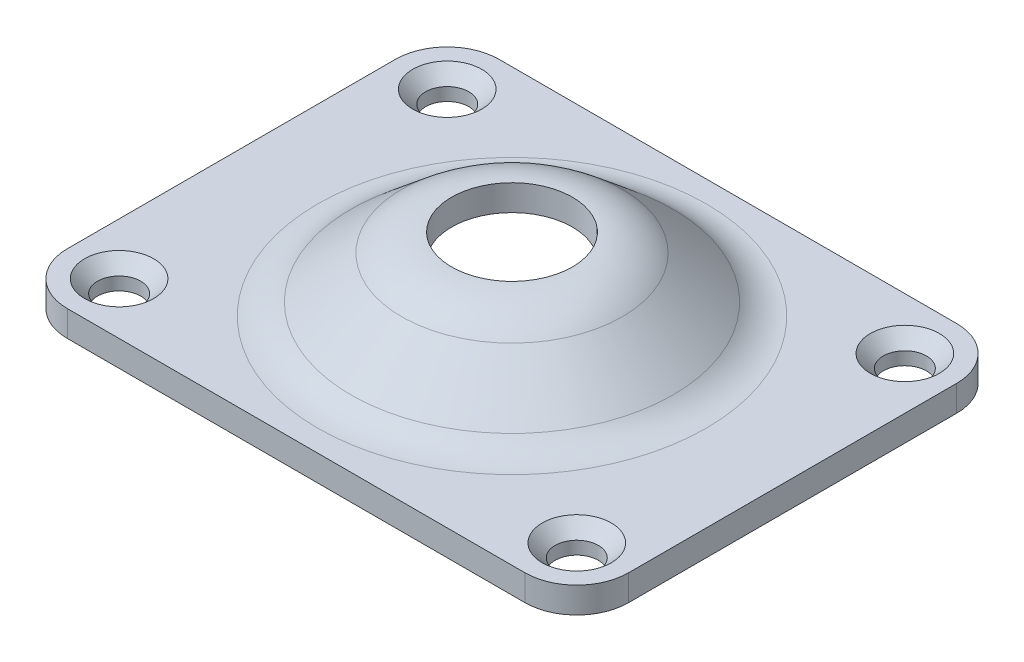
ISO-10303-21;
HEADER;
FILE_DESCRIPTION(('STEP AP214'),'2;1');
FILE_NAME('part.step','',(''),(''),'','','');
FILE_SCHEMA(('AUTOMOTIVE_DESIGN { 1 0 10303 214 1 1 1 1 }'));
ENDSEC;
DATA;
#1=APPLICATION_CONTEXT('core data for automotive mechanical design processes');
#2=APPLICATION_PROTOCOL_DEFINITION('international standard','automotive_design',2000,#1);
#3=PRODUCT_CONTEXT('',#1,'mechanical');
#4=PRODUCT('Part','Part','',(#3));
#5=PRODUCT_RELATED_PRODUCT_CATEGORY('part','',(#4));
#6=PRODUCT_DEFINITION_FORMATION('','',#4);
#7=PRODUCT_DEFINITION_CONTEXT('part definition',#1,'design');
#8=PRODUCT_DEFINITION('design','',#6,#7);
#9=PRODUCT_DEFINITION_SHAPE('','',#8);
#10=(LENGTH_UNIT() NAMED_UNIT(*) SI_UNIT(.MILLI.,.METRE.));
#11=(NAMED_UNIT(*) PLANE_ANGLE_UNIT() SI_UNIT($,.RADIAN.));
#12=(NAMED_UNIT(*) SI_UNIT($,.STERADIAN.) SOLID_ANGLE_UNIT());
#13=UNCERTAINTY_MEASURE_WITH_UNIT(LENGTH_MEASURE(1.E-05),#10,'distance_accuracy_value','');
#14=(GEOMETRIC_REPRESENTATION_CONTEXT(3) GLOBAL_UNCERTAINTY_ASSIGNED_CONTEXT((#13)) GLOBAL_UNIT_ASSIGNED_CONTEXT((#10,
#11,#12)) REPRESENTATION_CONTEXT('',''));
#15=CARTESIAN_POINT('',(0.,0.,0.));
#16=DIRECTION('',(0.,0.,1.));
#17=DIRECTION('',(1.,0.,0.));
#18=AXIS2_PLACEMENT_3D('',#15,#16,#17);
#19=CARTESIAN_POINT('',(-26.5,3.,19.));
#20=DIRECTION('',(0.,-1.,0.));
#21=DIRECTION('',(0.,0.,-1.));
#22=AXIS2_PLACEMENT_3D('',#19,#20,#21);
#23=PLANE('',#22);
#24=CARTESIAN_POINT('',(26.5,3.,19.));
#25=DIRECTION('',(0.,-1.,0.));
#26=DIRECTION('',(0.,0.,-1.));
#27=AXIS2_PLACEMENT_3D('',#24,#25,#26);
#28=CIRCLE('',#27,3.99999999999999);
#29=CARTESIAN_POINT('',(26.5,3.,23.));
#30=VERTEX_POINT('',#29);
#31=EDGE_CURVE('E177',#30,#30,#28,.T.);
#32=ORIENTED_EDGE('',*,*,#31,.T.);
#33=EDGE_LOOP('',(#32));
#34=FACE_BOUND('',#33,.T.);
#35=CARTESIAN_POINT('',(-26.5,3.,19.));
#36=DIRECTION('',(0.,-1.,0.));
#37=DIRECTION('',(0.,0.,-1.));
#38=AXIS2_PLACEMENT_3D('',#35,#36,#37);
#39=CIRCLE('',#38,3.99999999999999);
#40=CARTESIAN_POINT('',(-26.5,3.,23.));
#41=VERTEX_POINT('',#40);
#42=EDGE_CURVE('E174',#41,#41,#39,.T.);
#43=ORIENTED_EDGE('',*,*,#42,.T.);
#44=EDGE_LOOP('',(#43));
#45=FACE_BOUND('',#44,.T.);
#46=CARTESIAN_POINT('',(-26.5,3.,-19.));
#47=DIRECTION('',(0.,-1.,0.));
#48=DIRECTION('',(0.,0.,-1.));
#49=AXIS2_PLACEMENT_3D('',#46,#47,#48);
#50=CIRCLE('',#49,3.99999999999999);
#51=CARTESIAN_POINT('',(-26.5,3.,-15.));
#52=VERTEX_POINT('',#51);
#53=EDGE_CURVE('E171',#52,#52,#50,.T.);
#54=ORIENTED_EDGE('',*,*,#53,.T.);
#55=EDGE_LOOP('',(#54));
#56=FACE_BOUND('',#55,.T.);
#57=CARTESIAN_POINT('',(26.5,3.,-19.));
#58=DIRECTION('',(0.,-1.,0.));
#59=DIRECTION('',(0.,0.,-1.));
#60=AXIS2_PLACEMENT_3D('',#57,#58,#59);
#61=CIRCLE('',#60,3.99999999999999);
#62=CARTESIAN_POINT('',(26.5,3.,-15.));
#63=VERTEX_POINT('',#62);
#64=EDGE_CURVE('E168',#63,#63,#61,.T.);
#65=ORIENTED_EDGE('',*,*,#64,.T.);
#66=EDGE_LOOP('',(#65));
#67=FACE_BOUND('',#66,.T.);
#68=CARTESIAN_POINT('',(-26.5,3.,19.));
#69=DIRECTION('',(0.,1.,0.));
#70=DIRECTION('',(0.,0.,-1.));
#71=AXIS2_PLACEMENT_3D('',#68,#69,#70);
#72=CIRCLE('',#71,6.);
#73=CARTESIAN_POINT('',(-32.5,3.,19.));
#74=VERTEX_POINT('',#73);
#75=CARTESIAN_POINT('',(-26.5,3.,25.));
#76=VERTEX_POINT('',#75);
#77=EDGE_CURVE('E150',#74,#76,#72,.T.);
#78=ORIENTED_EDGE('',*,*,#77,.T.);
#79=DIRECTION('',(1.,0.,0.));
#80=VECTOR('',#79,1.);
#81=CARTESIAN_POINT('',(-26.5,3.,25.));
#82=LINE('',#81,#80);
#83=CARTESIAN_POINT('',(26.4999999999999,3.,25.));
#84=VERTEX_POINT('',#83);
#85=EDGE_CURVE('E98',#76,#84,#82,.T.);
#86=ORIENTED_EDGE('',*,*,#85,.T.);
#87=CARTESIAN_POINT('',(26.5,3.,19.));
#88=DIRECTION('',(0.,1.,0.));
#89=DIRECTION('',(0.,0.,1.));
#90=AXIS2_PLACEMENT_3D('',#87,#88,#89);
#91=CIRCLE('',#90,6.);
#92=CARTESIAN_POINT('',(32.5,3.,19.));
#93=VERTEX_POINT('',#92);
#94=EDGE_CURVE('E280',#84,#93,#91,.T.);
#95=ORIENTED_EDGE('',*,*,#94,.T.);
#96=DIRECTION('',(0.,0.,-1.));
#97=VECTOR('',#96,1.);
#98=CARTESIAN_POINT('',(32.5,3.,19.));
#99=LINE('',#98,#97);
#100=CARTESIAN_POINT('',(32.5,3.,-19.));
#101=VERTEX_POINT('',#100);
#102=EDGE_CURVE('E282',#93,#101,#99,.T.);
#103=ORIENTED_EDGE('',*,*,#102,.T.);
#104=CARTESIAN_POINT('',(26.5,3.,-19.));
#105=DIRECTION('',(0.,1.,0.));
#106=DIRECTION('',(0.,0.,-1.));
#107=AXIS2_PLACEMENT_3D('',#104,#105,#106);
#108=CIRCLE('',#107,6.);
#109=CARTESIAN_POINT('',(26.4999999999999,3.,-25.));
#110=VERTEX_POINT('',#109);
#111=EDGE_CURVE('E117',#101,#110,#108,.T.);
#112=ORIENTED_EDGE('',*,*,#111,.T.);
#113=DIRECTION('',(-1.,0.,0.));
#114=VECTOR('',#113,1.);
#115=CARTESIAN_POINT('',(-26.5,3.,-25.));
#116=LINE('',#115,#114);
#117=CARTESIAN_POINT('',(-26.5,3.,-25.));
#118=VERTEX_POINT('',#117);
#119=EDGE_CURVE('E111',#110,#118,#116,.T.);
#120=ORIENTED_EDGE('',*,*,#119,.T.);
#121=CARTESIAN_POINT('',(-26.5,3.,-19.));
#122=DIRECTION('',(0.,1.,0.));
#123=DIRECTION('',(0.,0.,-1.));
#124=AXIS2_PLACEMENT_3D('',#121,#122,#123);
#125=CIRCLE('',#124,6.);
#126=CARTESIAN_POINT('',(-32.5,3.,-19.));
#127=VERTEX_POINT('',#126);
#128=EDGE_CURVE('E115',#118,#127,#125,.T.);
#129=ORIENTED_EDGE('',*,*,#128,.T.);
#130=DIRECTION('',(0.,0.,1.));
#131=VECTOR('',#130,1.);
#132=CARTESIAN_POINT('',(-32.5,3.,19.));
#133=LINE('',#132,#131);
#134=EDGE_CURVE('E54',#127,#74,#133,.T.);
#135=ORIENTED_EDGE('',*,*,#134,.T.);
#136=EDGE_LOOP('',(#78,#86,#95,#103,#112,#120,#129,#135));
#137=FACE_BOUND('',#136,.T.);
#138=CARTESIAN_POINT('',(0.,3.,0.));
#139=DIRECTION('',(0.,1.,0.));
#140=DIRECTION('',(0.,0.,1.));
#141=AXIS2_PLACEMENT_3D('',#138,#139,#140);
#142=CIRCLE('',#141,22.5);
#143=CARTESIAN_POINT('',(0.,3.,22.5));
#144=VERTEX_POINT('',#143);
#145=EDGE_CURVE('E264',#144,#144,#142,.T.);
#146=ORIENTED_EDGE('',*,*,#145,.F.);
#147=EDGE_LOOP('',(#146));
#148=FACE_BOUND('',#147,.T.);
#149=ADVANCED_FACE('F37',(#34,#45,#56,#67,#137,#148),#23,.F.);
#150=CARTESIAN_POINT('',(-26.5,0.,19.));
#151=DIRECTION('',(0.,-1.,0.));
#152=DIRECTION('',(0.,0.,-1.));
#153=AXIS2_PLACEMENT_3D('',#150,#151,#152);
#154=PLANE('',#153);
#155=CARTESIAN_POINT('',(26.5,0.,19.));
#156=DIRECTION('',(0.,1.,0.));
#157=DIRECTION('',(0.,0.,1.));
#158=AXIS2_PLACEMENT_3D('',#155,#156,#157);
#159=CIRCLE('',#158,2.5);
#160=CARTESIAN_POINT('',(26.5,0.,21.5));
#161=VERTEX_POINT('',#160);
#162=EDGE_CURVE('E262',#161,#161,#159,.T.);
#163=ORIENTED_EDGE('',*,*,#162,.T.);
#164=EDGE_LOOP('',(#163));
#165=FACE_BOUND('',#164,.T.);
#166=CARTESIAN_POINT('',(-26.5,0.,-19.));
#167=DIRECTION('',(0.,1.,0.));
#168=DIRECTION('',(0.,0.,1.));
#169=AXIS2_PLACEMENT_3D('',#166,#167,#168);
#170=CIRCLE('',#169,2.5);
#171=CARTESIAN_POINT('',(-26.5,0.,-16.5));
#172=VERTEX_POINT('',#171);
#173=EDGE_CURVE('E267',#172,#172,#170,.T.);
#174=ORIENTED_EDGE('',*,*,#173,.T.);
#175=EDGE_LOOP('',(#174));
#176=FACE_BOUND('',#175,.T.);
#177=CARTESIAN_POINT('',(-26.5,0.,19.));
#178=DIRECTION('',(0.,1.,0.));
#179=DIRECTION('',(0.,0.,-1.));
#180=AXIS2_PLACEMENT_3D('',#177,#178,#179);
#181=CIRCLE('',#180,6.);
#182=CARTESIAN_POINT('',(-32.5,0.,19.));
#183=VERTEX_POINT('',#182);
#184=CARTESIAN_POINT('',(-26.5,0.,25.));
#185=VERTEX_POINT('',#184);
#186=EDGE_CURVE('E135',#183,#185,#181,.T.);
#187=ORIENTED_EDGE('',*,*,#186,.F.);
#188=DIRECTION('',(0.,0.,1.));
#189=VECTOR('',#188,1.);
#190=CARTESIAN_POINT('',(-32.5,0.,19.));
#191=LINE('',#190,#189);
#192=CARTESIAN_POINT('',(-32.5,0.,-19.));
#193=VERTEX_POINT('',#192);
#194=EDGE_CURVE('E89',#193,#183,#191,.T.);
#195=ORIENTED_EDGE('',*,*,#194,.F.);
#196=CARTESIAN_POINT('',(-26.5,0.,-19.));
#197=DIRECTION('',(0.,1.,0.));
#198=DIRECTION('',(0.,0.,-1.));
#199=AXIS2_PLACEMENT_3D('',#196,#197,#198);
#200=CIRCLE('',#199,6.);
#201=CARTESIAN_POINT('',(-26.5,0.,-25.));
#202=VERTEX_POINT('',#201);
#203=EDGE_CURVE('E83',#202,#193,#200,.T.);
#204=ORIENTED_EDGE('',*,*,#203,.F.);
#205=DIRECTION('',(-1.,0.,0.));
#206=VECTOR('',#205,1.);
#207=CARTESIAN_POINT('',(-26.5,0.,-25.));
#208=LINE('',#207,#206);
#209=CARTESIAN_POINT('',(26.4999999999999,0.,-25.));
#210=VERTEX_POINT('',#209);
#211=EDGE_CURVE('E125',#210,#202,#208,.T.);
#212=ORIENTED_EDGE('',*,*,#211,.F.);
#213=CARTESIAN_POINT('',(26.5,0.,-19.));
#214=DIRECTION('',(0.,1.,0.));
#215=DIRECTION('',(0.,0.,-1.));
#216=AXIS2_PLACEMENT_3D('',#213,#214,#215);
#217=CIRCLE('',#216,6.);
#218=CARTESIAN_POINT('',(32.5,0.,-19.));
#219=VERTEX_POINT('',#218);
#220=EDGE_CURVE('E145',#219,#210,#217,.T.);
#221=ORIENTED_EDGE('',*,*,#220,.F.);
#222=DIRECTION('',(0.,0.,-1.));
#223=VECTOR('',#222,1.);
#224=CARTESIAN_POINT('',(32.5,0.,19.));
#225=LINE('',#224,#223);
#226=CARTESIAN_POINT('',(32.5,0.,19.));
#227=VERTEX_POINT('',#226);
#228=EDGE_CURVE('E143',#227,#219,#225,.T.);
#229=ORIENTED_EDGE('',*,*,#228,.F.);
#230=CARTESIAN_POINT('',(26.5,0.,19.));
#231=DIRECTION('',(0.,1.,0.));
#232=DIRECTION('',(0.,0.,1.));
#233=AXIS2_PLACEMENT_3D('',#230,#231,#232);
#234=CIRCLE('',#233,6.);
#235=CARTESIAN_POINT('',(26.4999999999999,0.,25.));
#236=VERTEX_POINT('',#235);
#237=EDGE_CURVE('E141',#236,#227,#234,.T.);
#238=ORIENTED_EDGE('',*,*,#237,.F.);
#239=DIRECTION('',(1.,0.,0.));
#240=VECTOR('',#239,1.);
#241=CARTESIAN_POINT('',(-26.5,0.,25.));
#242=LINE('',#241,#240);
#243=EDGE_CURVE('E138',#185,#236,#242,.T.);
#244=ORIENTED_EDGE('',*,*,#243,.F.);
#245=EDGE_LOOP('',(#187,#195,#204,#212,#221,#229,#238,#244));
#246=FACE_BOUND('',#245,.T.);
#247=CARTESIAN_POINT('',(-26.5,0.,19.));
#248=DIRECTION('',(0.,1.,0.));
#249=DIRECTION('',(0.,0.,1.));
#250=AXIS2_PLACEMENT_3D('',#247,#248,#249);
#251=CIRCLE('',#250,2.5);
#252=CARTESIAN_POINT('',(-26.5,0.,21.5));
#253=VERTEX_POINT('',#252);
#254=EDGE_CURVE('E139',#253,#253,#251,.T.);
#255=ORIENTED_EDGE('',*,*,#254,.T.);
#256=EDGE_LOOP('',(#255));
#257=FACE_BOUND('',#256,.T.);
#258=CARTESIAN_POINT('',(26.5,0.,-19.));
#259=DIRECTION('',(0.,1.,0.));
#260=DIRECTION('',(0.,0.,1.));
#261=AXIS2_PLACEMENT_3D('',#258,#259,#260);
#262=CIRCLE('',#261,2.5);
#263=CARTESIAN_POINT('',(26.5,0.,-16.5));
#264=VERTEX_POINT('',#263);
#265=EDGE_CURVE('E263',#264,#264,#262,.T.);
#266=ORIENTED_EDGE('',*,*,#265,.T.);
#267=EDGE_LOOP('',(#266));
#268=FACE_BOUND('',#267,.T.);
#269=CARTESIAN_POINT('',(0.,0.,0.));
#270=DIRECTION('',(0.,-1.,0.));
#271=DIRECTION('',(1.,0.,0.));
#272=AXIS2_PLACEMENT_3D('',#269,#270,#271);
#273=CIRCLE('',#272,22.5);
#274=CARTESIAN_POINT('',(22.5,0.,0.));
#275=VERTEX_POINT('',#274);
#276=EDGE_CURVE('E301',#275,#275,#273,.T.);
#277=ORIENTED_EDGE('',*,*,#276,.F.);
#278=EDGE_LOOP('',(#277));
#279=FACE_BOUND('',#278,.T.);
#280=ADVANCED_FACE('F202',(#165,#176,#246,#257,#268,#279),#154,.T.);
#281=CARTESIAN_POINT('',(-26.5,3.,19.));
#282=DIRECTION('',(0.,-1.,0.));
#283=DIRECTION('',(0.,0.,-1.));
#284=AXIS2_PLACEMENT_3D('',#281,#282,#283);
#285=CYLINDRICAL_SURFACE('',#284,6.);
#286=ORIENTED_EDGE('',*,*,#186,.T.);
#287=DIRECTION('',(0.,-1.,0.));
#288=VECTOR('',#287,1.);
#289=CARTESIAN_POINT('',(-26.5,3.,25.));
#290=LINE('',#289,#288);
#291=EDGE_CURVE('E163',#76,#185,#290,.T.);
#292=ORIENTED_EDGE('',*,*,#291,.F.);
#293=ORIENTED_EDGE('',*,*,#77,.F.);
#294=DIRECTION('',(0.,-1.,0.));
#295=VECTOR('',#294,1.);
#296=CARTESIAN_POINT('',(-32.5,3.,19.));
#297=LINE('',#296,#295);
#298=EDGE_CURVE('E131',#74,#183,#297,.T.);
#299=ORIENTED_EDGE('',*,*,#298,.T.);
#300=EDGE_LOOP('',(#286,#292,#293,#299));
#301=FACE_BOUND('',#300,.T.);
#302=ADVANCED_FACE('F208',(#301),#285,.T.);
#303=CARTESIAN_POINT('',(-26.5,3.,25.));
#304=DIRECTION('',(0.,0.,-1.));
#305=DIRECTION('',(-1.,0.,0.));
#306=AXIS2_PLACEMENT_3D('',#303,#304,#305);
#307=PLANE('',#306);
#308=ORIENTED_EDGE('',*,*,#243,.T.);
#309=DIRECTION('',(0.,-1.,0.));
#310=VECTOR('',#309,1.);
#311=CARTESIAN_POINT('',(26.4999999999999,3.,25.));
#312=LINE('',#311,#310);
#313=EDGE_CURVE('E160',#84,#236,#312,.T.);
#314=ORIENTED_EDGE('',*,*,#313,.F.);
#315=ORIENTED_EDGE('',*,*,#85,.F.);
#316=ORIENTED_EDGE('',*,*,#291,.T.);
#317=EDGE_LOOP('',(#308,#314,#315,#316));
#318=FACE_BOUND('',#317,.T.);
#319=ADVANCED_FACE('F234',(#318),#307,.F.);
#320=CARTESIAN_POINT('',(26.5,3.,19.));
#321=DIRECTION('',(0.,-1.,0.));
#322=DIRECTION('',(0.,0.,-1.));
#323=AXIS2_PLACEMENT_3D('',#320,#321,#322);
#324=CYLINDRICAL_SURFACE('',#323,6.);
#325=ORIENTED_EDGE('',*,*,#237,.T.);
#326=DIRECTION('',(0.,-1.,0.));
#327=VECTOR('',#326,1.);
#328=CARTESIAN_POINT('',(32.5,3.,19.));
#329=LINE('',#328,#327);
#330=EDGE_CURVE('E157',#93,#227,#329,.T.);
#331=ORIENTED_EDGE('',*,*,#330,.F.);
#332=ORIENTED_EDGE('',*,*,#94,.F.);
#333=ORIENTED_EDGE('',*,*,#313,.T.);
#334=EDGE_LOOP('',(#325,#331,#332,#333));
#335=FACE_BOUND('',#334,.T.);
#336=ADVANCED_FACE('F230',(#335),#324,.T.);
#337=CARTESIAN_POINT('',(32.5,3.,19.));
#338=DIRECTION('',(-1.,0.,0.));
#339=DIRECTION('',(0.,0.,1.));
#340=AXIS2_PLACEMENT_3D('',#337,#338,#339);
#341=PLANE('',#340);
#342=ORIENTED_EDGE('',*,*,#228,.T.);
#343=DIRECTION('',(0.,-1.,0.));
#344=VECTOR('',#343,1.);
#345=CARTESIAN_POINT('',(32.5,3.,-19.));
#346=LINE('',#345,#344);
#347=EDGE_CURVE('E154',#101,#219,#346,.T.);
#348=ORIENTED_EDGE('',*,*,#347,.F.);
#349=ORIENTED_EDGE('',*,*,#102,.F.);
#350=ORIENTED_EDGE('',*,*,#330,.T.);
#351=EDGE_LOOP('',(#342,#348,#349,#350));
#352=FACE_BOUND('',#351,.T.);
#353=ADVANCED_FACE('F226',(#352),#341,.F.);
#354=CARTESIAN_POINT('',(26.5,3.,-19.));
#355=DIRECTION('',(0.,-1.,0.));
#356=DIRECTION('',(0.,0.,-1.));
#357=AXIS2_PLACEMENT_3D('',#354,#355,#356);
#358=CYLINDRICAL_SURFACE('',#357,6.);
#359=ORIENTED_EDGE('',*,*,#220,.T.);
#360=DIRECTION('',(0.,-1.,0.));
#361=VECTOR('',#360,1.);
#362=CARTESIAN_POINT('',(26.4999999999999,3.,-25.));
#363=LINE('',#362,#361);
#364=EDGE_CURVE('E126',#110,#210,#363,.T.);
#365=ORIENTED_EDGE('',*,*,#364,.F.);
#366=ORIENTED_EDGE('',*,*,#111,.F.);
#367=ORIENTED_EDGE('',*,*,#347,.T.);
#368=EDGE_LOOP('',(#359,#365,#366,#367));
#369=FACE_BOUND('',#368,.T.);
#370=ADVANCED_FACE('F223',(#369),#358,.T.);
#371=CARTESIAN_POINT('',(-26.5,3.,-25.));
#372=DIRECTION('',(0.,0.,1.));
#373=DIRECTION('',(1.,0.,0.));
#374=AXIS2_PLACEMENT_3D('',#371,#372,#373);
#375=PLANE('',#374);
#376=ORIENTED_EDGE('',*,*,#211,.T.);
#377=DIRECTION('',(0.,-1.,0.));
#378=VECTOR('',#377,1.);
#379=CARTESIAN_POINT('',(-26.5,3.,-25.));
#380=LINE('',#379,#378);
#381=EDGE_CURVE('E122',#118,#202,#380,.T.);
#382=ORIENTED_EDGE('',*,*,#381,.F.);
#383=ORIENTED_EDGE('',*,*,#119,.F.);
#384=ORIENTED_EDGE('',*,*,#364,.T.);
#385=EDGE_LOOP('',(#376,#382,#383,#384));
#386=FACE_BOUND('',#385,.T.);
#387=ADVANCED_FACE('F123',(#386),#375,.F.);
#388=CARTESIAN_POINT('',(-26.5,3.,-19.));
#389=DIRECTION('',(0.,-1.,0.));
#390=DIRECTION('',(0.,0.,-1.));
#391=AXIS2_PLACEMENT_3D('',#388,#389,#390);
#392=CYLINDRICAL_SURFACE('',#391,6.);
#393=ORIENTED_EDGE('',*,*,#203,.T.);
#394=DIRECTION('',(0.,-1.,0.));
#395=VECTOR('',#394,1.);
#396=CARTESIAN_POINT('',(-32.5,3.,-19.));
#397=LINE('',#396,#395);
#398=EDGE_CURVE('E127',#127,#193,#397,.T.);
#399=ORIENTED_EDGE('',*,*,#398,.F.);
#400=ORIENTED_EDGE('',*,*,#128,.F.);
#401=ORIENTED_EDGE('',*,*,#381,.T.);
#402=EDGE_LOOP('',(#393,#399,#400,#401));
#403=FACE_BOUND('',#402,.T.);
#404=ADVANCED_FACE('F129',(#403),#392,.T.);
#405=CARTESIAN_POINT('',(-32.5,3.,19.));
#406=DIRECTION('',(1.,0.,0.));
#407=DIRECTION('',(0.,0.,-1.));
#408=AXIS2_PLACEMENT_3D('',#405,#406,#407);
#409=PLANE('',#408);
#410=ORIENTED_EDGE('',*,*,#194,.T.);
#411=ORIENTED_EDGE('',*,*,#298,.F.);
#412=ORIENTED_EDGE('',*,*,#134,.F.);
#413=ORIENTED_EDGE('',*,*,#398,.T.);
#414=EDGE_LOOP('',(#410,#411,#412,#413));
#415=FACE_BOUND('',#414,.T.);
#416=ADVANCED_FACE('F216',(#415),#409,.F.);
#417=CARTESIAN_POINT('',(-26.5,3.,19.));
#418=DIRECTION('',(0.,-1.,0.));
#419=DIRECTION('',(0.,0.,-1.));
#420=AXIS2_PLACEMENT_3D('',#417,#418,#419);
#421=CYLINDRICAL_SURFACE('',#420,2.5);
#422=CARTESIAN_POINT('',(-26.5,1.50000000000001,19.));
#423=DIRECTION('',(0.,-1.,0.));
#424=DIRECTION('',(0.,0.,-1.));
#425=AXIS2_PLACEMENT_3D('',#422,#423,#424);
#426=CIRCLE('',#425,2.5);
#427=CARTESIAN_POINT('',(-26.5,1.50000000000001,21.5));
#428=VERTEX_POINT('',#427);
#429=EDGE_CURVE('E180',#428,#428,#426,.F.);
#430=ORIENTED_EDGE('',*,*,#429,.T.);
#431=EDGE_LOOP('',(#430));
#432=FACE_BOUND('',#431,.T.);
#433=ORIENTED_EDGE('',*,*,#254,.F.);
#434=EDGE_LOOP('',(#433));
#435=FACE_BOUND('',#434,.T.);
#436=ADVANCED_FACE('F213',(#432,#435),#421,.F.);
#437=CARTESIAN_POINT('',(-26.5,3.,-19.));
#438=DIRECTION('',(0.,-1.,0.));
#439=DIRECTION('',(0.,0.,-1.));
#440=AXIS2_PLACEMENT_3D('',#437,#438,#439);
#441=CYLINDRICAL_SURFACE('',#440,2.5);
#442=CARTESIAN_POINT('',(-26.5,1.50000000000001,-19.));
#443=DIRECTION('',(0.,-1.,0.));
#444=DIRECTION('',(0.,0.,-1.));
#445=AXIS2_PLACEMENT_3D('',#442,#443,#444);
#446=CIRCLE('',#445,2.5);
#447=CARTESIAN_POINT('',(-26.5,1.50000000000001,-16.5));
#448=VERTEX_POINT('',#447);
#449=EDGE_CURVE('E46',#448,#448,#446,.F.);
#450=ORIENTED_EDGE('',*,*,#449,.T.);
#451=EDGE_LOOP('',(#450));
#452=FACE_BOUND('',#451,.T.);
#453=ORIENTED_EDGE('',*,*,#173,.F.);
#454=EDGE_LOOP('',(#453));
#455=FACE_BOUND('',#454,.T.);
#456=ADVANCED_FACE('F185',(#452,#455),#441,.F.);
#457=CARTESIAN_POINT('',(26.5,3.,-19.));
#458=DIRECTION('',(0.,-1.,0.));
#459=DIRECTION('',(0.,0.,-1.));
#460=AXIS2_PLACEMENT_3D('',#457,#458,#459);
#461=CYLINDRICAL_SURFACE('',#460,2.5);
#462=CARTESIAN_POINT('',(26.5,1.50000000000001,-19.));
#463=DIRECTION('',(0.,-1.,0.));
#464=DIRECTION('',(0.,0.,-1.));
#465=AXIS2_PLACEMENT_3D('',#462,#463,#464);
#466=CIRCLE('',#465,2.5);
#467=CARTESIAN_POINT('',(26.5,1.50000000000001,-16.5));
#468=VERTEX_POINT('',#467);
#469=EDGE_CURVE('E11',#468,#468,#466,.F.);
#470=ORIENTED_EDGE('',*,*,#469,.T.);
#471=EDGE_LOOP('',(#470));
#472=FACE_BOUND('',#471,.T.);
#473=ORIENTED_EDGE('',*,*,#265,.F.);
#474=EDGE_LOOP('',(#473));
#475=FACE_BOUND('',#474,.T.);
#476=ADVANCED_FACE('F258',(#472,#475),#461,.F.);
#477=CARTESIAN_POINT('',(26.5,3.,19.));
#478=DIRECTION('',(0.,-1.,0.));
#479=DIRECTION('',(0.,0.,-1.));
#480=AXIS2_PLACEMENT_3D('',#477,#478,#479);
#481=CYLINDRICAL_SURFACE('',#480,2.5);
#482=CARTESIAN_POINT('',(26.5,1.50000000000001,19.));
#483=DIRECTION('',(0.,-1.,0.));
#484=DIRECTION('',(0.,0.,-1.));
#485=AXIS2_PLACEMENT_3D('',#482,#483,#484);
#486=CIRCLE('',#485,2.5);
#487=CARTESIAN_POINT('',(26.5,1.50000000000001,21.5));
#488=VERTEX_POINT('',#487);
#489=EDGE_CURVE('E165',#488,#488,#486,.F.);
#490=ORIENTED_EDGE('',*,*,#489,.T.);
#491=EDGE_LOOP('',(#490));
#492=FACE_BOUND('',#491,.T.);
#493=ORIENTED_EDGE('',*,*,#162,.F.);
#494=EDGE_LOOP('',(#493));
#495=FACE_BOUND('',#494,.T.);
#496=ADVANCED_FACE('F254',(#492,#495),#481,.F.);
#497=CARTESIAN_POINT('',(0.,9.,0.));
#498=DIRECTION('',(0.,-1.,0.));
#499=DIRECTION('',(1.,0.,0.));
#500=AXIS2_PLACEMENT_3D('',#497,#498,#499);
#501=TOROIDAL_SURFACE('',#500,22.5,6.);
#502=ORIENTED_EDGE('',*,*,#145,.T.);
#503=EDGE_LOOP('',(#502));
#504=FACE_BOUND('',#503,.T.);
#505=CARTESIAN_POINT('',(0.,4.40373334128613,0.));
#506=DIRECTION('',(0.,-1.,0.));
#507=DIRECTION('',(1.,0.,0.));
#508=AXIS2_PLACEMENT_3D('',#505,#506,#507);
#509=CIRCLE('',#508,18.6432743418808);
#510=CARTESIAN_POINT('',(18.6432743418808,4.40373334128613,0.));
#511=VERTEX_POINT('',#510);
#512=EDGE_CURVE('E270',#511,#511,#509,.T.);
#513=ORIENTED_EDGE('',*,*,#512,.T.);
#514=EDGE_LOOP('',(#513));
#515=FACE_BOUND('',#514,.T.);
#516=ADVANCED_FACE('F257',(#504,#515),#501,.F.);
#517=CARTESIAN_POINT('',(0.,9.31933493133446,0.));
#518=DIRECTION('',(0.,-1.,0.));
#519=DIRECTION('',(1.,0.,0.));
#520=AXIS2_PLACEMENT_3D('',#517,#518,#519);
#521=CONICAL_SURFACE('',#520,12.7850884871788,0.872664625997166);
#522=ORIENTED_EDGE('',*,*,#512,.F.);
#523=EDGE_LOOP('',(#522));
#524=FACE_BOUND('',#523,.T.);
#525=CARTESIAN_POINT('',(0.,9.31933493133446,0.));
#526=DIRECTION('',(0.,-1.,0.));
#527=DIRECTION('',(1.,0.,0.));
#528=AXIS2_PLACEMENT_3D('',#525,#526,#527);
#529=CIRCLE('',#528,12.7850884871788);
#530=CARTESIAN_POINT('',(12.7850884871788,9.31933493133446,0.));
#531=VERTEX_POINT('',#530);
#532=EDGE_CURVE('E317',#531,#531,#529,.T.);
#533=ORIENTED_EDGE('',*,*,#532,.T.);
#534=EDGE_LOOP('',(#533));
#535=FACE_BOUND('',#534,.T.);
#536=ADVANCED_FACE('F323',(#524,#535),#521,.T.);
#537=CARTESIAN_POINT('',(0.,2.42493494326365,0.));
#538=DIRECTION('',(0.,-1.,0.));
#539=DIRECTION('',(1.,0.,0.));
#540=AXIS2_PLACEMENT_3D('',#537,#538,#539);
#541=DEGENERATE_TOROIDAL_SURFACE('',#540,7.,9.,.T.);
#542=ORIENTED_EDGE('',*,*,#532,.F.);
#543=EDGE_LOOP('',(#542));
#544=FACE_BOUND('',#543,.T.);
#545=CARTESIAN_POINT('',(0.,11.4249349432636,0.));
#546=DIRECTION('',(0.,-1.,0.));
#547=DIRECTION('',(1.,0.,0.));
#548=AXIS2_PLACEMENT_3D('',#545,#546,#547);
#549=CIRCLE('',#548,7.);
#550=CARTESIAN_POINT('',(7.,11.4249349432636,0.));
#551=VERTEX_POINT('',#550);
#552=EDGE_CURVE('E314',#551,#551,#549,.T.);
#553=ORIENTED_EDGE('',*,*,#552,.T.);
#554=EDGE_LOOP('',(#553));
#555=FACE_BOUND('',#554,.T.);
#556=ADVANCED_FACE('F326',(#544,#555),#541,.T.);
#557=CARTESIAN_POINT('',(0.,0.,0.));
#558=DIRECTION('',(0.,-1.,0.));
#559=DIRECTION('',(1.,0.,0.));
#560=AXIS2_PLACEMENT_3D('',#557,#558,#559);
#561=CYLINDRICAL_SURFACE('',#560,7.);
#562=ORIENTED_EDGE('',*,*,#552,.F.);
#563=EDGE_LOOP('',(#562));
#564=FACE_BOUND('',#563,.T.);
#565=CARTESIAN_POINT('',(0.,8.42493494326365,0.));
#566=DIRECTION('',(0.,-1.,0.));
#567=DIRECTION('',(1.,0.,0.));
#568=AXIS2_PLACEMENT_3D('',#565,#566,#567);
#569=CIRCLE('',#568,7.);
#570=CARTESIAN_POINT('',(7.,8.42493494326365,0.));
#571=VERTEX_POINT('',#570);
#572=EDGE_CURVE('E311',#571,#571,#569,.T.);
#573=ORIENTED_EDGE('',*,*,#572,.T.);
#574=EDGE_LOOP('',(#573));
#575=FACE_BOUND('',#574,.T.);
#576=ADVANCED_FACE('F332',(#564,#575),#561,.F.);
#577=CARTESIAN_POINT('',(0.,2.42493494326365,0.));
#578=DIRECTION('',(0.,-1.,0.));
#579=DIRECTION('',(1.,0.,0.));
#580=AXIS2_PLACEMENT_3D('',#577,#578,#579);
#581=TOROIDAL_SURFACE('',#580,7.,6.);
#582=ORIENTED_EDGE('',*,*,#572,.F.);
#583=EDGE_LOOP('',(#582));
#584=FACE_BOUND('',#583,.T.);
#585=CARTESIAN_POINT('',(0.,7.02120160197752,0.));
#586=DIRECTION('',(0.,-1.,0.));
#587=DIRECTION('',(1.,0.,0.));
#588=AXIS2_PLACEMENT_3D('',#585,#586,#587);
#589=CIRCLE('',#588,10.8567256581192);
#590=CARTESIAN_POINT('',(10.8567256581192,7.02120160197752,0.));
#591=VERTEX_POINT('',#590);
#592=EDGE_CURVE('E306',#591,#591,#589,.T.);
#593=ORIENTED_EDGE('',*,*,#592,.T.);
#594=EDGE_LOOP('',(#593));
#595=FACE_BOUND('',#594,.T.);
#596=ADVANCED_FACE('F338',(#584,#595),#581,.F.);
#597=CARTESIAN_POINT('',(0.,2.10560001192919,0.));
#598=DIRECTION('',(0.,-1.,0.));
#599=DIRECTION('',(1.,0.,0.));
#600=AXIS2_PLACEMENT_3D('',#597,#598,#599);
#601=CONICAL_SURFACE('',#600,16.7149115128212,0.872664625997166);
#602=ORIENTED_EDGE('',*,*,#592,.F.);
#603=EDGE_LOOP('',(#602));
#604=FACE_BOUND('',#603,.T.);
#605=CARTESIAN_POINT('',(0.,2.10560001192919,0.));
#606=DIRECTION('',(0.,-1.,0.));
#607=DIRECTION('',(1.,0.,0.));
#608=AXIS2_PLACEMENT_3D('',#605,#606,#607);
#609=CIRCLE('',#608,16.7149115128212);
#610=CARTESIAN_POINT('',(16.7149115128212,2.10560001192919,0.));
#611=VERTEX_POINT('',#610);
#612=EDGE_CURVE('E303',#611,#611,#609,.T.);
#613=ORIENTED_EDGE('',*,*,#612,.T.);
#614=EDGE_LOOP('',(#613));
#615=FACE_BOUND('',#614,.T.);
#616=ADVANCED_FACE('F247',(#604,#615),#601,.F.);
#617=CARTESIAN_POINT('',(0.,9.,0.));
#618=DIRECTION('',(0.,-1.,0.));
#619=DIRECTION('',(1.,0.,0.));
#620=AXIS2_PLACEMENT_3D('',#617,#618,#619);
#621=TOROIDAL_SURFACE('',#620,22.5,9.);
#622=ORIENTED_EDGE('',*,*,#612,.F.);
#623=EDGE_LOOP('',(#622));
#624=FACE_BOUND('',#623,.T.);
#625=ORIENTED_EDGE('',*,*,#276,.T.);
#626=EDGE_LOOP('',(#625));
#627=FACE_BOUND('',#626,.T.);
#628=ADVANCED_FACE('F242',(#624,#627),#621,.T.);
#629=CARTESIAN_POINT('',(26.5,1.50000000000001,19.));
#630=DIRECTION('',(0.,1.,0.));
#631=DIRECTION('',(0.,0.,1.));
#632=AXIS2_PLACEMENT_3D('',#629,#630,#631);
#633=CONICAL_SURFACE('',#632,2.5,0.785398163397448);
#634=CARTESIAN_POINT('',(26.5,3.,23.));
#635=CARTESIAN_POINT('',(26.5,2.984375,22.984375));
#636=CARTESIAN_POINT('',(26.5,2.96875,22.96875));
#637=CARTESIAN_POINT('',(26.5,2.9375,22.9375));
#638=CARTESIAN_POINT('',(26.5,2.921875,22.921875));
#639=CARTESIAN_POINT('',(26.5,2.890625,22.890625));
#640=CARTESIAN_POINT('',(26.5,2.875,22.875));
#641=CARTESIAN_POINT('',(26.5,2.84375,22.84375));
#642=CARTESIAN_POINT('',(26.5,2.828125,22.828125));
#643=CARTESIAN_POINT('',(26.5,2.796875,22.796875));
#644=CARTESIAN_POINT('',(26.5,2.78125,22.78125));
#645=CARTESIAN_POINT('',(26.5,2.75,22.75));
#646=CARTESIAN_POINT('',(26.5,2.734375,22.734375));
#647=CARTESIAN_POINT('',(26.5,2.703125,22.703125));
#648=CARTESIAN_POINT('',(26.5,2.6875,22.6875));
#649=CARTESIAN_POINT('',(26.5,2.65625,22.65625));
#650=CARTESIAN_POINT('',(26.5,2.640625,22.640625));
#651=CARTESIAN_POINT('',(26.5,2.609375,22.609375));
#652=CARTESIAN_POINT('',(26.5,2.59375,22.59375));
#653=CARTESIAN_POINT('',(26.5,2.5625,22.5625));
#654=CARTESIAN_POINT('',(26.5,2.546875,22.546875));
#655=CARTESIAN_POINT('',(26.5,2.515625,22.515625));
#656=CARTESIAN_POINT('',(26.5,2.5,22.5));
#657=CARTESIAN_POINT('',(26.5,2.46875,22.46875));
#658=CARTESIAN_POINT('',(26.5,2.453125,22.453125));
#659=CARTESIAN_POINT('',(26.5,2.421875,22.421875));
#660=CARTESIAN_POINT('',(26.5,2.40625,22.40625));
#661=CARTESIAN_POINT('',(26.5,2.375,22.375));
#662=CARTESIAN_POINT('',(26.5,2.359375,22.359375));
#663=CARTESIAN_POINT('',(26.5,2.328125,22.328125));
#664=CARTESIAN_POINT('',(26.5,2.3125,22.3125));
#665=CARTESIAN_POINT('',(26.5,2.28125,22.28125));
#666=CARTESIAN_POINT('',(26.5,2.265625,22.265625));
#667=CARTESIAN_POINT('',(26.5,2.234375,22.234375));
#668=CARTESIAN_POINT('',(26.5,2.21875,22.21875));
#669=CARTESIAN_POINT('',(26.5,2.1875,22.1875));
#670=CARTESIAN_POINT('',(26.5,2.171875,22.171875));
#671=CARTESIAN_POINT('',(26.5,2.140625,22.140625));
#672=CARTESIAN_POINT('',(26.5,2.125,22.125));
#673=CARTESIAN_POINT('',(26.5,2.09375,22.09375));
#674=CARTESIAN_POINT('',(26.5,2.078125,22.078125));
#675=CARTESIAN_POINT('',(26.5,2.046875,22.046875));
#676=CARTESIAN_POINT('',(26.5,2.03125,22.03125));
#677=CARTESIAN_POINT('',(26.5,2.00000000000001,22.));
#678=CARTESIAN_POINT('',(26.5,1.98437500000001,21.984375));
#679=CARTESIAN_POINT('',(26.5,1.95312500000001,21.953125));
#680=CARTESIAN_POINT('',(26.5,1.9375,21.9375));
#681=CARTESIAN_POINT('',(26.5,1.90625000000001,21.90625));
#682=CARTESIAN_POINT('',(26.5,1.89062500000001,21.890625));
#683=CARTESIAN_POINT('',(26.5,1.85937500000001,21.859375));
#684=CARTESIAN_POINT('',(26.5,1.84375000000001,21.84375));
#685=CARTESIAN_POINT('',(26.5,1.81250000000001,21.8125));
#686=CARTESIAN_POINT('',(26.5,1.79687500000001,21.796875));
#687=CARTESIAN_POINT('',(26.5,1.76562500000001,21.765625));
#688=CARTESIAN_POINT('',(26.5,1.75000000000001,21.75));
#689=CARTESIAN_POINT('',(26.5,1.71875000000001,21.71875));
#690=CARTESIAN_POINT('',(26.5,1.70312500000001,21.703125));
#691=CARTESIAN_POINT('',(26.5,1.67187500000001,21.671875));
#692=CARTESIAN_POINT('',(26.5,1.65625000000001,21.65625));
#693=CARTESIAN_POINT('',(26.5,1.62500000000001,21.625));
#694=CARTESIAN_POINT('',(26.5,1.60937500000001,21.609375));
#695=CARTESIAN_POINT('',(26.5,1.57812500000001,21.578125));
#696=CARTESIAN_POINT('',(26.5,1.56250000000001,21.5625));
#697=CARTESIAN_POINT('',(26.5,1.53125000000001,21.53125));
#698=CARTESIAN_POINT('',(26.5,1.51562500000001,21.515625));
#699=CARTESIAN_POINT('',(26.5,1.50000000000001,21.5));
#700=B_SPLINE_CURVE_WITH_KNOTS('',3,(#634,#635,#636,#637,#638,#639,#640,#641,#642,#643,#644,
#645,#646,#647,#648,#649,#650,#651,#652,#653,#654,#655,#656,#657,#658,#659,#660,#661,#662,#663,
#664,#665,#666,#667,#668,#669,#670,#671,#672,#673,#674,#675,#676,#677,#678,#679,#680,#681,#682,
#683,#684,#685,#686,#687,#688,#689,#690,#691,#692,#693,#694,#695,#696,#697,#698,#699),
.UNSPECIFIED.,.F.,.F.,(4,2,2,2,2,2,2,2,2,2,2,2,2,2,2,2,2,2,2,2,2,2,2,2,2,2,2,2,2,2,2,2,4),(0.,
0.0662912607362374,0.132582521472477,0.198873782208715,0.265165042944955,0.331456303681192,
0.39774756441743,0.46403882515367,0.530330085889907,0.596621346626144,0.662912607362385,
0.729203868098622,0.795495128834862,0.861786389571099,0.928077650307339,0.994368911043576,
1.06066017177981,1.12695143251605,1.19324269325229,1.25953395398853,1.32582521472477,
1.39211647546101,1.45840773619725,1.52469899693348,1.59099025766972,1.65728151840596,
1.7235727791422,1.78986403987844,1.85615530061468,1.92244656135092,1.98873782208715,
2.05502908282339,2.12132034355963),.UNSPECIFIED.);
#701=EDGE_CURVE('BSEAM197',#30,#488,#700,.T.);
#702=ORIENTED_EDGE('',*,*,#31,.F.);
#703=ORIENTED_EDGE('',*,*,#489,.F.);
#704=ORIENTED_EDGE('',*,*,#701,.T.);
#705=ORIENTED_EDGE('',*,*,#701,.F.);
#706=EDGE_LOOP('',(#702,#704,#703,#705));
#707=FACE_BOUND('',#706,.T.);
#708=ADVANCED_FACE('F197',(#707),#633,.F.);
#709=CARTESIAN_POINT('',(-26.5,1.50000000000001,19.));
#710=DIRECTION('',(0.,1.,0.));
#711=DIRECTION('',(0.,0.,1.));
#712=AXIS2_PLACEMENT_3D('',#709,#710,#711);
#713=CONICAL_SURFACE('',#712,2.5,0.785398163397448);
#714=CARTESIAN_POINT('',(-26.5,3.,23.));
#715=CARTESIAN_POINT('',(-26.5,2.984375,22.984375));
#716=CARTESIAN_POINT('',(-26.5,2.96875,22.96875));
#717=CARTESIAN_POINT('',(-26.5,2.9375,22.9375));
#718=CARTESIAN_POINT('',(-26.5,2.921875,22.921875));
#719=CARTESIAN_POINT('',(-26.5,2.890625,22.890625));
#720=CARTESIAN_POINT('',(-26.5,2.875,22.875));
#721=CARTESIAN_POINT('',(-26.5,2.84375,22.84375));
#722=CARTESIAN_POINT('',(-26.5,2.828125,22.828125));
#723=CARTESIAN_POINT('',(-26.5,2.796875,22.796875));
#724=CARTESIAN_POINT('',(-26.5,2.78125,22.78125));
#725=CARTESIAN_POINT('',(-26.5,2.75,22.75));
#726=CARTESIAN_POINT('',(-26.5,2.734375,22.734375));
#727=CARTESIAN_POINT('',(-26.5,2.703125,22.703125));
#728=CARTESIAN_POINT('',(-26.5,2.6875,22.6875));
#729=CARTESIAN_POINT('',(-26.5,2.65625,22.65625));
#730=CARTESIAN_POINT('',(-26.5,2.640625,22.640625));
#731=CARTESIAN_POINT('',(-26.5,2.609375,22.609375));
#732=CARTESIAN_POINT('',(-26.5,2.59375,22.59375));
#733=CARTESIAN_POINT('',(-26.5,2.5625,22.5625));
#734=CARTESIAN_POINT('',(-26.5,2.546875,22.546875));
#735=CARTESIAN_POINT('',(-26.5,2.515625,22.515625));
#736=CARTESIAN_POINT('',(-26.5,2.5,22.5));
#737=CARTESIAN_POINT('',(-26.5,2.46875,22.46875));
#738=CARTESIAN_POINT('',(-26.5,2.453125,22.453125));
#739=CARTESIAN_POINT('',(-26.5,2.421875,22.421875));
#740=CARTESIAN_POINT('',(-26.5,2.40625,22.40625));
#741=CARTESIAN_POINT('',(-26.5,2.375,22.375));
#742=CARTESIAN_POINT('',(-26.5,2.359375,22.359375));
#743=CARTESIAN_POINT('',(-26.5,2.328125,22.328125));
#744=CARTESIAN_POINT('',(-26.5,2.3125,22.3125));
#745=CARTESIAN_POINT('',(-26.5,2.28125,22.28125));
#746=CARTESIAN_POINT('',(-26.5,2.265625,22.265625));
#747=CARTESIAN_POINT('',(-26.5,2.234375,22.234375));
#748=CARTESIAN_POINT('',(-26.5,2.21875,22.21875));
#749=CARTESIAN_POINT('',(-26.5,2.1875,22.1875));
#750=CARTESIAN_POINT('',(-26.5,2.171875,22.171875));
#751=CARTESIAN_POINT('',(-26.5,2.140625,22.140625));
#752=CARTESIAN_POINT('',(-26.5,2.125,22.125));
#753=CARTESIAN_POINT('',(-26.5,2.09375,22.09375));
#754=CARTESIAN_POINT('',(-26.5,2.078125,22.078125));
#755=CARTESIAN_POINT('',(-26.5,2.046875,22.046875));
#756=CARTESIAN_POINT('',(-26.5,2.03125,22.03125));
#757=CARTESIAN_POINT('',(-26.5,2.00000000000001,22.));
#758=CARTESIAN_POINT('',(-26.5,1.98437500000001,21.984375));
#759=CARTESIAN_POINT('',(-26.5,1.95312500000001,21.953125));
#760=CARTESIAN_POINT('',(-26.5,1.9375,21.9375));
#761=CARTESIAN_POINT('',(-26.5,1.90625000000001,21.90625));
#762=CARTESIAN_POINT('',(-26.5,1.89062500000001,21.890625));
#763=CARTESIAN_POINT('',(-26.5,1.85937500000001,21.859375));
#764=CARTESIAN_POINT('',(-26.5,1.84375000000001,21.84375));
#765=CARTESIAN_POINT('',(-26.5,1.81250000000001,21.8125));
#766=CARTESIAN_POINT('',(-26.5,1.79687500000001,21.796875));
#767=CARTESIAN_POINT('',(-26.5,1.76562500000001,21.765625));
#768=CARTESIAN_POINT('',(-26.5,1.75000000000001,21.75));
#769=CARTESIAN_POINT('',(-26.5,1.71875000000001,21.71875));
#770=CARTESIAN_POINT('',(-26.5,1.70312500000001,21.703125));
#771=CARTESIAN_POINT('',(-26.5,1.67187500000001,21.671875));
#772=CARTESIAN_POINT('',(-26.5,1.65625000000001,21.65625));
#773=CARTESIAN_POINT('',(-26.5,1.62500000000001,21.625));
#774=CARTESIAN_POINT('',(-26.5,1.60937500000001,21.609375));
#775=CARTESIAN_POINT('',(-26.5,1.57812500000001,21.578125));
#776=CARTESIAN_POINT('',(-26.5,1.56250000000001,21.5625));
#777=CARTESIAN_POINT('',(-26.5,1.53125000000001,21.53125));
#778=CARTESIAN_POINT('',(-26.5,1.51562500000001,21.515625));
#779=CARTESIAN_POINT('',(-26.5,1.50000000000001,21.5));
#780=B_SPLINE_CURVE_WITH_KNOTS('',3,(#714,#715,#716,#717,#718,#719,#720,#721,#722,#723,#724,
#725,#726,#727,#728,#729,#730,#731,#732,#733,#734,#735,#736,#737,#738,#739,#740,#741,#742,#743,
#744,#745,#746,#747,#748,#749,#750,#751,#752,#753,#754,#755,#756,#757,#758,#759,#760,#761,#762,
#763,#764,#765,#766,#767,#768,#769,#770,#771,#772,#773,#774,#775,#776,#777,#778,#779),
.UNSPECIFIED.,.F.,.F.,(4,2,2,2,2,2,2,2,2,2,2,2,2,2,2,2,2,2,2,2,2,2,2,2,2,2,2,2,2,2,2,2,4),(0.,
0.0662912607362374,0.132582521472477,0.198873782208715,0.265165042944955,0.331456303681192,
0.39774756441743,0.46403882515367,0.530330085889907,0.596621346626144,0.662912607362385,
0.729203868098622,0.795495128834862,0.861786389571099,0.928077650307339,0.994368911043576,
1.06066017177981,1.12695143251605,1.19324269325229,1.25953395398853,1.32582521472477,
1.39211647546101,1.45840773619725,1.52469899693348,1.59099025766972,1.65728151840596,
1.7235727791422,1.78986403987844,1.85615530061468,1.92244656135092,1.98873782208715,
2.05502908282339,2.12132034355963),.UNSPECIFIED.);
#781=EDGE_CURVE('BSEAM190',#41,#428,#780,.T.);
#782=ORIENTED_EDGE('',*,*,#42,.F.);
#783=ORIENTED_EDGE('',*,*,#429,.F.);
#784=ORIENTED_EDGE('',*,*,#781,.T.);
#785=ORIENTED_EDGE('',*,*,#781,.F.);
#786=EDGE_LOOP('',(#782,#784,#783,#785));
#787=FACE_BOUND('',#786,.T.);
#788=ADVANCED_FACE('F190',(#787),#713,.F.);
#789=CARTESIAN_POINT('',(-26.5,1.50000000000001,-19.));
#790=DIRECTION('',(0.,1.,0.));
#791=DIRECTION('',(0.,0.,1.));
#792=AXIS2_PLACEMENT_3D('',#789,#790,#791);
#793=CONICAL_SURFACE('',#792,2.5,0.785398163397448);
#794=CARTESIAN_POINT('',(-26.5,3.,-15.));
#795=CARTESIAN_POINT('',(-26.5,2.984375,-15.015625));
#796=CARTESIAN_POINT('',(-26.5,2.96875,-15.03125));
#797=CARTESIAN_POINT('',(-26.5,2.9375,-15.0625));
#798=CARTESIAN_POINT('',(-26.5,2.921875,-15.078125));
#799=CARTESIAN_POINT('',(-26.5,2.890625,-15.109375));
#800=CARTESIAN_POINT('',(-26.5,2.875,-15.125));
#801=CARTESIAN_POINT('',(-26.5,2.84375,-15.15625));
#802=CARTESIAN_POINT('',(-26.5,2.828125,-15.171875));
#803=CARTESIAN_POINT('',(-26.5,2.796875,-15.203125));
#804=CARTESIAN_POINT('',(-26.5,2.78125,-15.21875));
#805=CARTESIAN_POINT('',(-26.5,2.75,-15.25));
#806=CARTESIAN_POINT('',(-26.5,2.734375,-15.265625));
#807=CARTESIAN_POINT('',(-26.5,2.703125,-15.296875));
#808=CARTESIAN_POINT('',(-26.5,2.6875,-15.3125));
#809=CARTESIAN_POINT('',(-26.5,2.65625,-15.34375));
#810=CARTESIAN_POINT('',(-26.5,2.640625,-15.359375));
#811=CARTESIAN_POINT('',(-26.5,2.609375,-15.390625));
#812=CARTESIAN_POINT('',(-26.5,2.59375,-15.40625));
#813=CARTESIAN_POINT('',(-26.5,2.5625,-15.4375));
#814=CARTESIAN_POINT('',(-26.5,2.546875,-15.453125));
#815=CARTESIAN_POINT('',(-26.5,2.515625,-15.484375));
#816=CARTESIAN_POINT('',(-26.5,2.5,-15.5));
#817=CARTESIAN_POINT('',(-26.5,2.46875,-15.53125));
#818=CARTESIAN_POINT('',(-26.5,2.453125,-15.546875));
#819=CARTESIAN_POINT('',(-26.5,2.421875,-15.578125));
#820=CARTESIAN_POINT('',(-26.5,2.40625,-15.59375));
#821=CARTESIAN_POINT('',(-26.5,2.375,-15.625));
#822=CARTESIAN_POINT('',(-26.5,2.359375,-15.640625));
#823=CARTESIAN_POINT('',(-26.5,2.328125,-15.671875));
#824=CARTESIAN_POINT('',(-26.5,2.3125,-15.6875));
#825=CARTESIAN_POINT('',(-26.5,2.28125,-15.71875));
#826=CARTESIAN_POINT('',(-26.5,2.265625,-15.734375));
#827=CARTESIAN_POINT('',(-26.5,2.234375,-15.765625));
#828=CARTESIAN_POINT('',(-26.5,2.21875,-15.78125));
#829=CARTESIAN_POINT('',(-26.5,2.1875,-15.8125));
#830=CARTESIAN_POINT('',(-26.5,2.171875,-15.828125));
#831=CARTESIAN_POINT('',(-26.5,2.140625,-15.859375));
#832=CARTESIAN_POINT('',(-26.5,2.125,-15.875));
#833=CARTESIAN_POINT('',(-26.5,2.09375,-15.90625));
#834=CARTESIAN_POINT('',(-26.5,2.078125,-15.921875));
#835=CARTESIAN_POINT('',(-26.5,2.046875,-15.953125));
#836=CARTESIAN_POINT('',(-26.5,2.03125,-15.96875));
#837=CARTESIAN_POINT('',(-26.5,2.00000000000001,-16.));
#838=CARTESIAN_POINT('',(-26.5,1.98437500000001,-16.015625));
#839=CARTESIAN_POINT('',(-26.5,1.95312500000001,-16.046875));
#840=CARTESIAN_POINT('',(-26.5,1.9375,-16.0625));
#841=CARTESIAN_POINT('',(-26.5,1.90625000000001,-16.09375));
#842=CARTESIAN_POINT('',(-26.5,1.89062500000001,-16.109375));
#843=CARTESIAN_POINT('',(-26.5,1.85937500000001,-16.140625));
#844=CARTESIAN_POINT('',(-26.5,1.84375000000001,-16.15625));
#845=CARTESIAN_POINT('',(-26.5,1.81250000000001,-16.1875));
#846=CARTESIAN_POINT('',(-26.5,1.79687500000001,-16.203125));
#847=CARTESIAN_POINT('',(-26.5,1.76562500000001,-16.234375));
#848=CARTESIAN_POINT('',(-26.5,1.75000000000001,-16.25));
#849=CARTESIAN_POINT('',(-26.5,1.71875000000001,-16.28125));
#850=CARTESIAN_POINT('',(-26.5,1.70312500000001,-16.296875));
#851=CARTESIAN_POINT('',(-26.5,1.67187500000001,-16.328125));
#852=CARTESIAN_POINT('',(-26.5,1.65625000000001,-16.34375));
#853=CARTESIAN_POINT('',(-26.5,1.62500000000001,-16.375));
#854=CARTESIAN_POINT('',(-26.5,1.60937500000001,-16.390625));
#855=CARTESIAN_POINT('',(-26.5,1.57812500000001,-16.421875));
#856=CARTESIAN_POINT('',(-26.5,1.56250000000001,-16.4375));
#857=CARTESIAN_POINT('',(-26.5,1.53125000000001,-16.46875));
#858=CARTESIAN_POINT('',(-26.5,1.51562500000001,-16.484375));
#859=CARTESIAN_POINT('',(-26.5,1.50000000000001,-16.5));
#860=B_SPLINE_CURVE_WITH_KNOTS('',3,(#794,#795,#796,#797,#798,#799,#800,#801,#802,#803,#804,
#805,#806,#807,#808,#809,#810,#811,#812,#813,#814,#815,#816,#817,#818,#819,#820,#821,#822,#823,
#824,#825,#826,#827,#828,#829,#830,#831,#832,#833,#834,#835,#836,#837,#838,#839,#840,#841,#842,
#843,#844,#845,#846,#847,#848,#849,#850,#851,#852,#853,#854,#855,#856,#857,#858,#859),
.UNSPECIFIED.,.F.,.F.,(4,2,2,2,2,2,2,2,2,2,2,2,2,2,2,2,2,2,2,2,2,2,2,2,2,2,2,2,2,2,2,2,4),(0.,
0.0662912607362374,0.132582521472477,0.198873782208715,0.265165042944953,0.331456303681192,
0.39774756441743,0.46403882515367,0.530330085889907,0.596621346626146,0.662912607362385,
0.729203868098623,0.795495128834862,0.861786389571099,0.928077650307339,0.994368911043576,
1.06066017177981,1.12695143251605,1.19324269325229,1.25953395398853,1.32582521472477,
1.39211647546101,1.45840773619725,1.52469899693348,1.59099025766972,1.65728151840596,
1.7235727791422,1.78986403987844,1.85615530061468,1.92244656135092,1.98873782208715,
2.05502908282339,2.12132034355963),.UNSPECIFIED.);
#861=EDGE_CURVE('BSEAM188',#52,#448,#860,.T.);
#862=ORIENTED_EDGE('',*,*,#53,.F.);
#863=ORIENTED_EDGE('',*,*,#449,.F.);
#864=ORIENTED_EDGE('',*,*,#861,.T.);
#865=ORIENTED_EDGE('',*,*,#861,.F.);
#866=EDGE_LOOP('',(#862,#864,#863,#865));
#867=FACE_BOUND('',#866,.T.);
#868=ADVANCED_FACE('F188',(#867),#793,.F.);
#869=CARTESIAN_POINT('',(26.5,1.50000000000001,-19.));
#870=DIRECTION('',(0.,1.,0.));
#871=DIRECTION('',(0.,0.,1.));
#872=AXIS2_PLACEMENT_3D('',#869,#870,#871);
#873=CONICAL_SURFACE('',#872,2.5,0.785398163397448);
#874=CARTESIAN_POINT('',(26.5,3.,-15.));
#875=CARTESIAN_POINT('',(26.5,2.984375,-15.015625));
#876=CARTESIAN_POINT('',(26.5,2.96875,-15.03125));
#877=CARTESIAN_POINT('',(26.5,2.9375,-15.0625));
#878=CARTESIAN_POINT('',(26.5,2.921875,-15.078125));
#879=CARTESIAN_POINT('',(26.5,2.890625,-15.109375));
#880=CARTESIAN_POINT('',(26.5,2.875,-15.125));
#881=CARTESIAN_POINT('',(26.5,2.84375,-15.15625));
#882=CARTESIAN_POINT('',(26.5,2.828125,-15.171875));
#883=CARTESIAN_POINT('',(26.5,2.796875,-15.203125));
#884=CARTESIAN_POINT('',(26.5,2.78125,-15.21875));
#885=CARTESIAN_POINT('',(26.5,2.75,-15.25));
#886=CARTESIAN_POINT('',(26.5,2.734375,-15.265625));
#887=CARTESIAN_POINT('',(26.5,2.703125,-15.296875));
#888=CARTESIAN_POINT('',(26.5,2.6875,-15.3125));
#889=CARTESIAN_POINT('',(26.5,2.65625,-15.34375));
#890=CARTESIAN_POINT('',(26.5,2.640625,-15.359375));
#891=CARTESIAN_POINT('',(26.5,2.609375,-15.390625));
#892=CARTESIAN_POINT('',(26.5,2.59375,-15.40625));
#893=CARTESIAN_POINT('',(26.5,2.5625,-15.4375));
#894=CARTESIAN_POINT('',(26.5,2.546875,-15.453125));
#895=CARTESIAN_POINT('',(26.5,2.515625,-15.484375));
#896=CARTESIAN_POINT('',(26.5,2.5,-15.5));
#897=CARTESIAN_POINT('',(26.5,2.46875,-15.53125));
#898=CARTESIAN_POINT('',(26.5,2.453125,-15.546875));
#899=CARTESIAN_POINT('',(26.5,2.421875,-15.578125));
#900=CARTESIAN_POINT('',(26.5,2.40625,-15.59375));
#901=CARTESIAN_POINT('',(26.5,2.375,-15.625));
#902=CARTESIAN_POINT('',(26.5,2.359375,-15.640625));
#903=CARTESIAN_POINT('',(26.5,2.328125,-15.671875));
#904=CARTESIAN_POINT('',(26.5,2.3125,-15.6875));
#905=CARTESIAN_POINT('',(26.5,2.28125,-15.71875));
#906=CARTESIAN_POINT('',(26.5,2.265625,-15.734375));
#907=CARTESIAN_POINT('',(26.5,2.234375,-15.765625));
#908=CARTESIAN_POINT('',(26.5,2.21875,-15.78125));
#909=CARTESIAN_POINT('',(26.5,2.1875,-15.8125));
#910=CARTESIAN_POINT('',(26.5,2.171875,-15.828125));
#911=CARTESIAN_POINT('',(26.5,2.140625,-15.859375));
#912=CARTESIAN_POINT('',(26.5,2.125,-15.875));
#913=CARTESIAN_POINT('',(26.5,2.09375,-15.90625));
#914=CARTESIAN_POINT('',(26.5,2.078125,-15.921875));
#915=CARTESIAN_POINT('',(26.5,2.046875,-15.953125));
#916=CARTESIAN_POINT('',(26.5,2.03125,-15.96875));
#917=CARTESIAN_POINT('',(26.5,2.00000000000001,-16.));
#918=CARTESIAN_POINT('',(26.5,1.98437500000001,-16.015625));
#919=CARTESIAN_POINT('',(26.5,1.95312500000001,-16.046875));
#920=CARTESIAN_POINT('',(26.5,1.9375,-16.0625));
#921=CARTESIAN_POINT('',(26.5,1.90625000000001,-16.09375));
#922=CARTESIAN_POINT('',(26.5,1.89062500000001,-16.109375));
#923=CARTESIAN_POINT('',(26.5,1.85937500000001,-16.140625));
#924=CARTESIAN_POINT('',(26.5,1.84375000000001,-16.15625));
#925=CARTESIAN_POINT('',(26.5,1.81250000000001,-16.1875));
#926=CARTESIAN_POINT('',(26.5,1.79687500000001,-16.203125));
#927=CARTESIAN_POINT('',(26.5,1.76562500000001,-16.234375));
#928=CARTESIAN_POINT('',(26.5,1.75000000000001,-16.25));
#929=CARTESIAN_POINT('',(26.5,1.71875000000001,-16.28125));
#930=CARTESIAN_POINT('',(26.5,1.70312500000001,-16.296875));
#931=CARTESIAN_POINT('',(26.5,1.67187500000001,-16.328125));
#932=CARTESIAN_POINT('',(26.5,1.65625000000001,-16.34375));
#933=CARTESIAN_POINT('',(26.5,1.62500000000001,-16.375));
#934=CARTESIAN_POINT('',(26.5,1.60937500000001,-16.390625));
#935=CARTESIAN_POINT('',(26.5,1.57812500000001,-16.421875));
#936=CARTESIAN_POINT('',(26.5,1.56250000000001,-16.4375));
#937=CARTESIAN_POINT('',(26.5,1.53125000000001,-16.46875));
#938=CARTESIAN_POINT('',(26.5,1.51562500000001,-16.484375));
#939=CARTESIAN_POINT('',(26.5,1.50000000000001,-16.5));
#940=B_SPLINE_CURVE_WITH_KNOTS('',3,(#874,#875,#876,#877,#878,#879,#880,#881,#882,#883,#884,
#885,#886,#887,#888,#889,#890,#891,#892,#893,#894,#895,#896,#897,#898,#899,#900,#901,#902,#903,
#904,#905,#906,#907,#908,#909,#910,#911,#912,#913,#914,#915,#916,#917,#918,#919,#920,#921,#922,
#923,#924,#925,#926,#927,#928,#929,#930,#931,#932,#933,#934,#935,#936,#937,#938,#939),
.UNSPECIFIED.,.F.,.F.,(4,2,2,2,2,2,2,2,2,2,2,2,2,2,2,2,2,2,2,2,2,2,2,2,2,2,2,2,2,2,2,2,4),(0.,
0.0662912607362374,0.132582521472477,0.198873782208715,0.265165042944953,0.331456303681192,
0.39774756441743,0.46403882515367,0.530330085889907,0.596621346626146,0.662912607362385,
0.729203868098623,0.795495128834862,0.861786389571099,0.928077650307339,0.994368911043576,
1.06066017177981,1.12695143251605,1.19324269325229,1.25953395398853,1.32582521472477,
1.39211647546101,1.45840773619725,1.52469899693348,1.59099025766972,1.65728151840596,
1.7235727791422,1.78986403987844,1.85615530061468,1.92244656135092,1.98873782208715,
2.05502908282339,2.12132034355963),.UNSPECIFIED.);
#941=EDGE_CURVE('BSEAM39',#63,#468,#940,.T.);
#942=ORIENTED_EDGE('',*,*,#64,.F.);
#943=ORIENTED_EDGE('',*,*,#469,.F.);
#944=ORIENTED_EDGE('',*,*,#941,.T.);
#945=ORIENTED_EDGE('',*,*,#941,.F.);
#946=EDGE_LOOP('',(#942,#944,#943,#945));
#947=FACE_BOUND('',#946,.T.);
#948=ADVANCED_FACE('F39',(#947),#873,.F.);
#949=CLOSED_SHELL('',(#149,#280,#302,#319,#336,#353,#370,#387,#404,#416,#436,#456,#476,#496,
#516,#536,#556,#576,#596,#616,#628,#708,#788,#868,#948));
#950=MANIFOLD_SOLID_BREP('B2',#949);
#951=ADVANCED_BREP_SHAPE_REPRESENTATION('',(#18,#950),#14);
#952=SHAPE_DEFINITION_REPRESENTATION(#9,#951);
ENDSEC;
END-ISO-10303-21;
